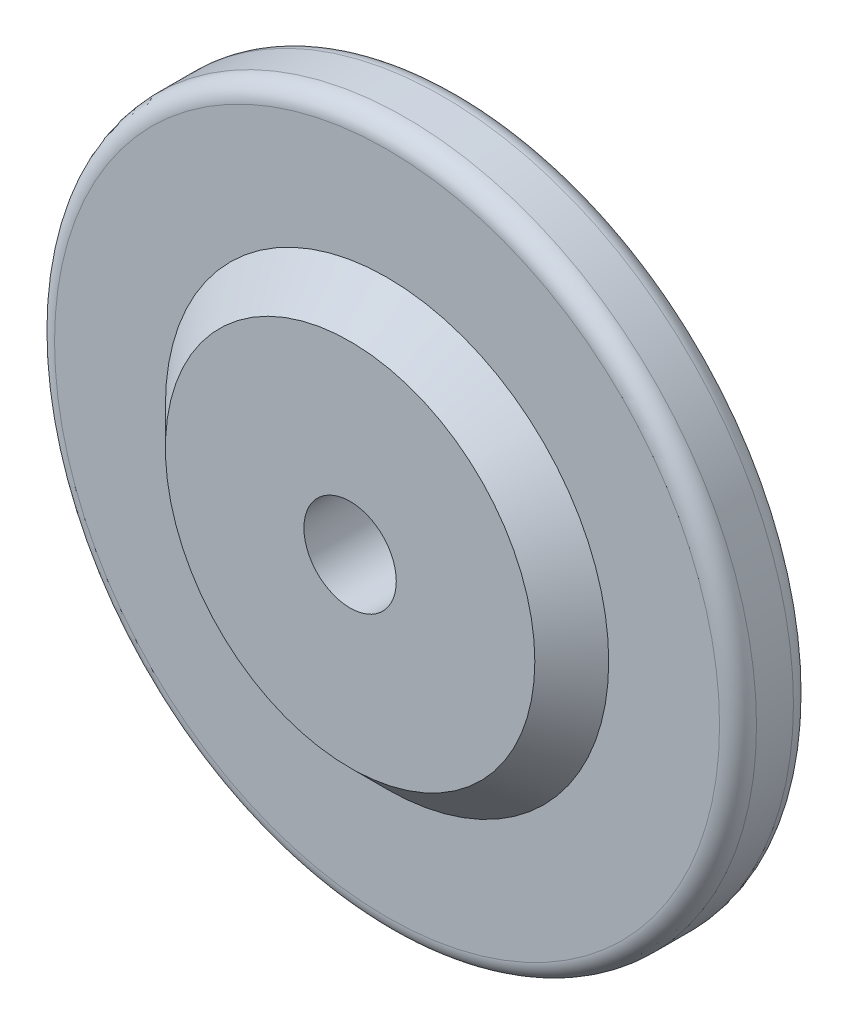
ISO-10303-21;
HEADER;
FILE_DESCRIPTION(('STEP AP214'),'2;1');
FILE_NAME('part.step','',(''),(''),'','','');
FILE_SCHEMA(('AUTOMOTIVE_DESIGN { 1 0 10303 214 1 1 1 1 }'));
ENDSEC;
DATA;
#1=APPLICATION_CONTEXT('core data for automotive mechanical design processes');
#2=APPLICATION_PROTOCOL_DEFINITION('international standard','automotive_design',2000,#1);
#3=PRODUCT_CONTEXT('',#1,'mechanical');
#4=PRODUCT('Part','Part','',(#3));
#5=PRODUCT_RELATED_PRODUCT_CATEGORY('part','',(#4));
#6=PRODUCT_DEFINITION_FORMATION('','',#4);
#7=PRODUCT_DEFINITION_CONTEXT('part definition',#1,'design');
#8=PRODUCT_DEFINITION('design','',#6,#7);
#9=PRODUCT_DEFINITION_SHAPE('','',#8);
#10=(LENGTH_UNIT() NAMED_UNIT(*) SI_UNIT(.MILLI.,.METRE.));
#11=(NAMED_UNIT(*) PLANE_ANGLE_UNIT() SI_UNIT($,.RADIAN.));
#12=(NAMED_UNIT(*) SI_UNIT($,.STERADIAN.) SOLID_ANGLE_UNIT());
#13=UNCERTAINTY_MEASURE_WITH_UNIT(LENGTH_MEASURE(1.E-05),#10,'distance_accuracy_value','');
#14=(GEOMETRIC_REPRESENTATION_CONTEXT(3) GLOBAL_UNCERTAINTY_ASSIGNED_CONTEXT((#13)) GLOBAL_UNIT_ASSIGNED_CONTEXT((#10,
#11,#12)) REPRESENTATION_CONTEXT('',''));
#15=CARTESIAN_POINT('',(0.,0.,0.));
#16=DIRECTION('',(0.,0.,1.));
#17=DIRECTION('',(1.,0.,0.));
#18=AXIS2_PLACEMENT_3D('',#15,#16,#17);
#19=CARTESIAN_POINT('',(0.,0.,2.));
#20=DIRECTION('',(0.,0.,-1.));
#21=DIRECTION('',(-1.,0.,0.));
#22=AXIS2_PLACEMENT_3D('',#19,#20,#21);
#23=CYLINDRICAL_SURFACE('',#22,9.5);
#24=CARTESIAN_POINT('',(0.,0.,0.5));
#25=DIRECTION('',(0.,0.,1.));
#26=DIRECTION('',(1.,0.,0.));
#27=AXIS2_PLACEMENT_3D('',#24,#25,#26);
#28=CIRCLE('',#27,9.5);
#29=CARTESIAN_POINT('',(9.5,0.,0.5));
#30=VERTEX_POINT('',#29);
#31=EDGE_CURVE('E43',#30,#30,#28,.T.);
#32=ORIENTED_EDGE('',*,*,#31,.T.);
#33=EDGE_LOOP('',(#32));
#34=FACE_BOUND('',#33,.T.);
#35=CARTESIAN_POINT('',(0.,0.,1.5));
#36=DIRECTION('',(0.,0.,1.));
#37=DIRECTION('',(1.,0.,0.));
#38=AXIS2_PLACEMENT_3D('',#35,#36,#37);
#39=CIRCLE('',#38,9.5);
#40=CARTESIAN_POINT('',(9.5,0.,1.5));
#41=VERTEX_POINT('',#40);
#42=EDGE_CURVE('E47',#41,#41,#39,.F.);
#43=ORIENTED_EDGE('',*,*,#42,.T.);
#44=EDGE_LOOP('',(#43));
#45=FACE_BOUND('',#44,.T.);
#46=ADVANCED_FACE('F32',(#34,#45),#23,.T.);
#47=CARTESIAN_POINT('',(0.,0.,2.));
#48=DIRECTION('',(0.,0.,1.));
#49=DIRECTION('',(1.,0.,0.));
#50=AXIS2_PLACEMENT_3D('',#47,#48,#49);
#51=PLANE('',#50);
#52=CARTESIAN_POINT('',(0.,0.,2.));
#53=DIRECTION('',(0.,0.,1.));
#54=DIRECTION('',(1.,0.,0.));
#55=AXIS2_PLACEMENT_3D('',#52,#53,#54);
#56=CIRCLE('',#55,9.);
#57=CARTESIAN_POINT('',(9.,0.,2.));
#58=VERTEX_POINT('',#57);
#59=EDGE_CURVE('E10',#58,#58,#56,.T.);
#60=ORIENTED_EDGE('',*,*,#59,.T.);
#61=EDGE_LOOP('',(#60));
#62=FACE_BOUND('',#61,.T.);
#63=CARTESIAN_POINT('',(0.,0.,2.));
#64=DIRECTION('',(0.,0.,1.));
#65=DIRECTION('',(1.,0.,0.));
#66=AXIS2_PLACEMENT_3D('',#63,#64,#65);
#67=CIRCLE('',#66,6.);
#68=CARTESIAN_POINT('',(6.,0.,2.));
#69=VERTEX_POINT('',#68);
#70=EDGE_CURVE('E52',#69,#69,#67,.T.);
#71=ORIENTED_EDGE('',*,*,#70,.F.);
#72=EDGE_LOOP('',(#71));
#73=FACE_BOUND('',#72,.T.);
#74=ADVANCED_FACE('F91',(#62,#73),#51,.T.);
#75=CARTESIAN_POINT('',(0.,0.,0.));
#76=DIRECTION('',(0.,0.,1.));
#77=DIRECTION('',(1.,0.,0.));
#78=AXIS2_PLACEMENT_3D('',#75,#76,#77);
#79=PLANE('',#78);
#80=CARTESIAN_POINT('',(0.,0.,0.));
#81=DIRECTION('',(0.,0.,1.));
#82=DIRECTION('',(1.,0.,0.));
#83=AXIS2_PLACEMENT_3D('',#80,#81,#82);
#84=CIRCLE('',#83,9.);
#85=CARTESIAN_POINT('',(9.,0.,0.));
#86=VERTEX_POINT('',#85);
#87=EDGE_CURVE('E39',#86,#86,#84,.F.);
#88=ORIENTED_EDGE('',*,*,#87,.T.);
#89=EDGE_LOOP('',(#88));
#90=FACE_BOUND('',#89,.T.);
#91=CARTESIAN_POINT('',(0.,0.,0.));
#92=DIRECTION('',(0.,0.,-1.));
#93=DIRECTION('',(-1.,0.,0.));
#94=AXIS2_PLACEMENT_3D('',#91,#92,#93);
#95=CIRCLE('',#94,8.5);
#96=CARTESIAN_POINT('',(-8.5,0.,0.));
#97=VERTEX_POINT('',#96);
#98=EDGE_CURVE('E64',#97,#97,#95,.T.);
#99=ORIENTED_EDGE('',*,*,#98,.F.);
#100=EDGE_LOOP('',(#99));
#101=FACE_BOUND('',#100,.T.);
#102=ADVANCED_FACE('F96',(#90,#101),#79,.F.);
#103=CARTESIAN_POINT('',(0.,0.,3.));
#104=DIRECTION('',(0.,0.,1.));
#105=DIRECTION('',(1.,0.,0.));
#106=AXIS2_PLACEMENT_3D('',#103,#104,#105);
#107=PLANE('',#106);
#108=CARTESIAN_POINT('',(0.,0.,3.));
#109=DIRECTION('',(0.,0.,1.));
#110=DIRECTION('',(1.,0.,0.));
#111=AXIS2_PLACEMENT_3D('',#108,#109,#110);
#112=CIRCLE('',#111,1.25);
#113=CARTESIAN_POINT('',(1.25,0.,3.));
#114=VERTEX_POINT('',#113);
#115=EDGE_CURVE('E67',#114,#114,#112,.F.);
#116=ORIENTED_EDGE('',*,*,#115,.T.);
#117=EDGE_LOOP('',(#116));
#118=FACE_BOUND('',#117,.T.);
#119=CARTESIAN_POINT('',(0.,0.,3.));
#120=DIRECTION('',(0.,0.,1.));
#121=DIRECTION('',(1.,0.,0.));
#122=AXIS2_PLACEMENT_3D('',#119,#120,#121);
#123=CIRCLE('',#122,5.);
#124=CARTESIAN_POINT('',(5.,0.,3.));
#125=VERTEX_POINT('',#124);
#126=EDGE_CURVE('E56',#125,#125,#123,.T.);
#127=ORIENTED_EDGE('',*,*,#126,.T.);
#128=EDGE_LOOP('',(#127));
#129=FACE_BOUND('',#128,.T.);
#130=ADVANCED_FACE('F71',(#118,#129),#107,.T.);
#131=CARTESIAN_POINT('',(0.,0.,2.));
#132=DIRECTION('',(0.,0.,-1.));
#133=DIRECTION('',(1.,0.,0.));
#134=AXIS2_PLACEMENT_3D('',#131,#132,#133);
#135=CONICAL_SURFACE('',#134,6.,0.78539816339745);
#136=ORIENTED_EDGE('',*,*,#126,.F.);
#137=EDGE_LOOP('',(#136));
#138=FACE_BOUND('',#137,.T.);
#139=ORIENTED_EDGE('',*,*,#70,.T.);
#140=EDGE_LOOP('',(#139));
#141=FACE_BOUND('',#140,.T.);
#142=ADVANCED_FACE('F144',(#138,#141),#135,.T.);
#143=CARTESIAN_POINT('',(0.,0.,0.));
#144=DIRECTION('',(0.,0.,-1.));
#145=DIRECTION('',(-1.,0.,0.));
#146=AXIS2_PLACEMENT_3D('',#143,#144,#145);
#147=CONICAL_SURFACE('',#146,8.5,1.46607657167524);
#148=CARTESIAN_POINT('',(0.,0.,0.25));
#149=DIRECTION('',(0.,0.,-1.));
#150=DIRECTION('',(-1.,0.,0.));
#151=AXIS2_PLACEMENT_3D('',#148,#149,#150);
#152=CIRCLE('',#151,6.1214088864443);
#153=CARTESIAN_POINT('',(-6.1214088864443,0.,0.25));
#154=VERTEX_POINT('',#153);
#155=EDGE_CURVE('E57',#154,#154,#152,.T.);
#156=ORIENTED_EDGE('',*,*,#155,.F.);
#157=EDGE_LOOP('',(#156));
#158=FACE_BOUND('',#157,.T.);
#159=ORIENTED_EDGE('',*,*,#98,.T.);
#160=EDGE_LOOP('',(#159));
#161=FACE_BOUND('',#160,.T.);
#162=ADVANCED_FACE('F85',(#158,#161),#147,.F.);
#163=CARTESIAN_POINT('',(0.,0.,0.25));
#164=DIRECTION('',(0.,0.,-1.));
#165=DIRECTION('',(-1.,0.,0.));
#166=AXIS2_PLACEMENT_3D('',#163,#164,#165);
#167=PLANE('',#166);
#168=CARTESIAN_POINT('',(0.,0.,0.25));
#169=DIRECTION('',(0.,0.,-1.));
#170=DIRECTION('',(-1.,0.,0.));
#171=AXIS2_PLACEMENT_3D('',#168,#169,#170);
#172=CIRCLE('',#171,1.25);
#173=CARTESIAN_POINT('',(-1.25,0.,0.25));
#174=VERTEX_POINT('',#173);
#175=EDGE_CURVE('E53',#174,#174,#172,.T.);
#176=ORIENTED_EDGE('',*,*,#175,.F.);
#177=EDGE_LOOP('',(#176));
#178=FACE_BOUND('',#177,.T.);
#179=ORIENTED_EDGE('',*,*,#155,.T.);
#180=EDGE_LOOP('',(#179));
#181=FACE_BOUND('',#180,.T.);
#182=ADVANCED_FACE('F77',(#178,#181),#167,.T.);
#183=CARTESIAN_POINT('',(0.,0.,2.));
#184=DIRECTION('',(0.,0.,-1.));
#185=DIRECTION('',(-1.,0.,0.));
#186=AXIS2_PLACEMENT_3D('',#183,#184,#185);
#187=CYLINDRICAL_SURFACE('',#186,1.25);
#188=ORIENTED_EDGE('',*,*,#175,.T.);
#189=EDGE_LOOP('',(#188));
#190=FACE_BOUND('',#189,.T.);
#191=ORIENTED_EDGE('',*,*,#115,.F.);
#192=EDGE_LOOP('',(#191));
#193=FACE_BOUND('',#192,.T.);
#194=ADVANCED_FACE('F74',(#190,#193),#187,.F.);
#195=CARTESIAN_POINT('',(0.,0.,0.5));
#196=DIRECTION('',(0.,0.,1.));
#197=DIRECTION('',(1.,0.,0.));
#198=AXIS2_PLACEMENT_3D('',#195,#196,#197);
#199=TOROIDAL_SURFACE('',#198,9.,0.5);
#200=ORIENTED_EDGE('',*,*,#87,.F.);
#201=EDGE_LOOP('',(#200));
#202=FACE_BOUND('',#201,.T.);
#203=ORIENTED_EDGE('',*,*,#31,.F.);
#204=EDGE_LOOP('',(#203));
#205=FACE_BOUND('',#204,.T.);
#206=ADVANCED_FACE('F76',(#202,#205),#199,.T.);
#207=CARTESIAN_POINT('',(0.,0.,1.5));
#208=DIRECTION('',(0.,0.,1.));
#209=DIRECTION('',(1.,0.,0.));
#210=AXIS2_PLACEMENT_3D('',#207,#208,#209);
#211=TOROIDAL_SURFACE('',#210,9.,0.5);
#212=ORIENTED_EDGE('',*,*,#42,.F.);
#213=EDGE_LOOP('',(#212));
#214=FACE_BOUND('',#213,.T.);
#215=ORIENTED_EDGE('',*,*,#59,.F.);
#216=EDGE_LOOP('',(#215));
#217=FACE_BOUND('',#216,.T.);
#218=ADVANCED_FACE('F34',(#214,#217),#211,.T.);
#219=CLOSED_SHELL('',(#46,#74,#102,#130,#142,#162,#182,#194,#206,#218));
#220=MANIFOLD_SOLID_BREP('B2',#219);
#221=ADVANCED_BREP_SHAPE_REPRESENTATION('',(#18,#220),#14);
#222=SHAPE_DEFINITION_REPRESENTATION(#9,#221);
ENDSEC;
END-ISO-10303-21;
